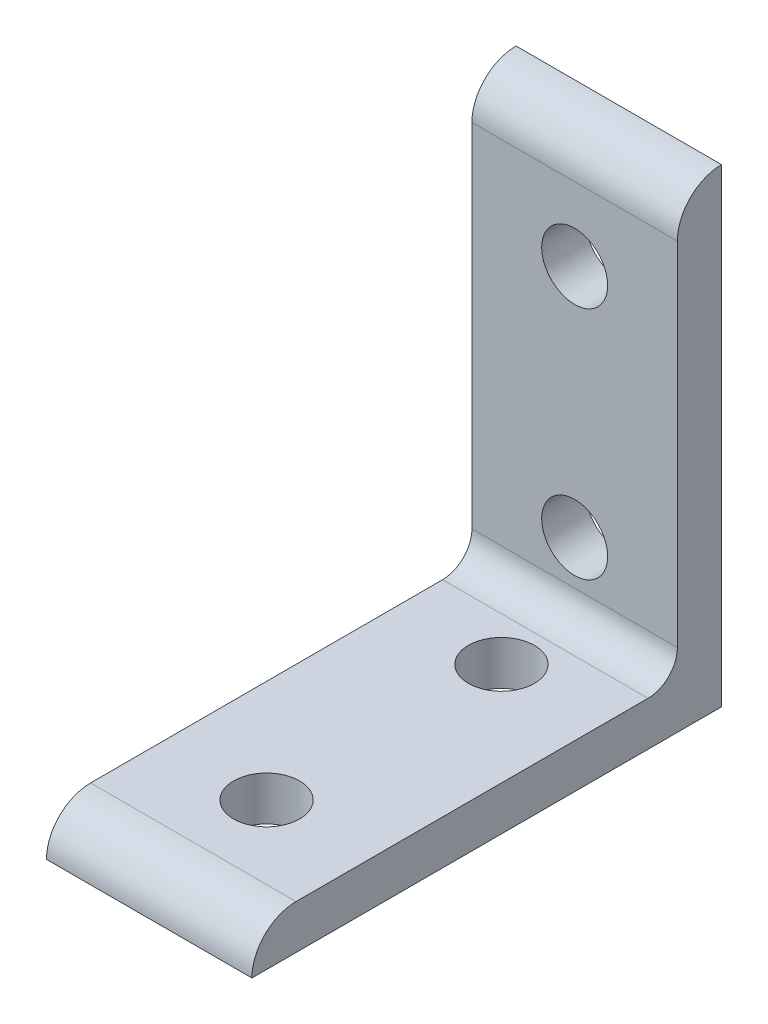
ISO-10303-21;
HEADER;
FILE_DESCRIPTION(('STEP AP214'),'2;1');
FILE_NAME('part.step','',(''),(''),'','','');
FILE_SCHEMA(('AUTOMOTIVE_DESIGN { 1 0 10303 214 1 1 1 1 }'));
ENDSEC;
DATA;
#1=APPLICATION_CONTEXT('core data for automotive mechanical design processes');
#2=APPLICATION_PROTOCOL_DEFINITION('international standard','automotive_design',2000,#1);
#3=PRODUCT_CONTEXT('',#1,'mechanical');
#4=PRODUCT('Part','Part','',(#3));
#5=PRODUCT_RELATED_PRODUCT_CATEGORY('part','',(#4));
#6=PRODUCT_DEFINITION_FORMATION('','',#4);
#7=PRODUCT_DEFINITION_CONTEXT('part definition',#1,'design');
#8=PRODUCT_DEFINITION('design','',#6,#7);
#9=PRODUCT_DEFINITION_SHAPE('','',#8);
#10=(LENGTH_UNIT() NAMED_UNIT(*) SI_UNIT(.MILLI.,.METRE.));
#11=(NAMED_UNIT(*) PLANE_ANGLE_UNIT() SI_UNIT($,.RADIAN.));
#12=(NAMED_UNIT(*) SI_UNIT($,.STERADIAN.) SOLID_ANGLE_UNIT());
#13=UNCERTAINTY_MEASURE_WITH_UNIT(LENGTH_MEASURE(1.E-05),#10,'distance_accuracy_value','');
#14=(GEOMETRIC_REPRESENTATION_CONTEXT(3) GLOBAL_UNCERTAINTY_ASSIGNED_CONTEXT((#13)) GLOBAL_UNIT_ASSIGNED_CONTEXT((#10,
#11,#12)) REPRESENTATION_CONTEXT('',''));
#15=CARTESIAN_POINT('',(0.,0.,0.));
#16=DIRECTION('',(0.,0.,1.));
#17=DIRECTION('',(1.,0.,0.));
#18=AXIS2_PLACEMENT_3D('',#15,#16,#17);
#19=CARTESIAN_POINT('',(0.,67.9224746981368,-22.6008362054));
#20=DIRECTION('',(1.,0.,0.));
#21=DIRECTION('',(0.,0.,-1.));
#22=AXIS2_PLACEMENT_3D('',#19,#20,#21);
#23=CYLINDRICAL_SURFACE('',#22,4.7752);
#24=CARTESIAN_POINT('',(22.225,67.9224746981368,-22.6008362054));
#25=DIRECTION('',(1.,0.,0.));
#26=DIRECTION('',(0.,0.,-1.));
#27=AXIS2_PLACEMENT_3D('',#24,#25,#26);
#28=CIRCLE('',#27,4.7752);
#29=CARTESIAN_POINT('',(22.225,72.6976746981368,-22.6008362054));
#30=VERTEX_POINT('',#29);
#31=CARTESIAN_POINT('',(22.225,67.9224746981368,-17.8256362054));
#32=VERTEX_POINT('',#31);
#33=EDGE_CURVE('E130',#30,#32,#28,.T.);
#34=ORIENTED_EDGE('',*,*,#33,.F.);
#35=DIRECTION('',(1.,0.,0.));
#36=VECTOR('',#35,1.);
#37=CARTESIAN_POINT('',(0.,72.6976746981368,-22.6008362054));
#38=LINE('',#37,#36);
#39=CARTESIAN_POINT('',(0.,72.6976746981368,-22.6008362054));
#40=VERTEX_POINT('',#39);
#41=EDGE_CURVE('E112',#40,#30,#38,.T.);
#42=ORIENTED_EDGE('',*,*,#41,.F.);
#43=CARTESIAN_POINT('',(0.,67.9224746981368,-22.6008362054));
#44=DIRECTION('',(1.,0.,0.));
#45=DIRECTION('',(0.,0.,-1.));
#46=AXIS2_PLACEMENT_3D('',#43,#44,#45);
#47=CIRCLE('',#46,4.7752);
#48=CARTESIAN_POINT('',(0.,67.9224746981368,-17.8256362054));
#49=VERTEX_POINT('',#48);
#50=EDGE_CURVE('E107',#40,#49,#47,.T.);
#51=ORIENTED_EDGE('',*,*,#50,.T.);
#52=DIRECTION('',(1.,0.,0.));
#53=VECTOR('',#52,1.);
#54=CARTESIAN_POINT('',(0.,67.9224746981368,-17.8256362054));
#55=LINE('',#54,#53);
#56=EDGE_CURVE('E89',#49,#32,#55,.T.);
#57=ORIENTED_EDGE('',*,*,#56,.T.);
#58=EDGE_LOOP('',(#34,#42,#51,#57));
#59=FACE_BOUND('',#58,.T.);
#60=ADVANCED_FACE('F32',(#59),#23,.T.);
#61=CARTESIAN_POINT('',(0.,21.8976746958,-22.6008362054));
#62=DIRECTION('',(0.,0.,-1.));
#63=DIRECTION('',(0.,1.,0.));
#64=AXIS2_PLACEMENT_3D('',#61,#62,#63);
#65=PLANE('',#64);
#66=CARTESIAN_POINT('',(11.1125,59.9976746958,-22.6008362054));
#67=DIRECTION('',(0.,0.,-1.));
#68=DIRECTION('',(-1.,0.,0.));
#69=AXIS2_PLACEMENT_3D('',#66,#67,#68);
#70=CIRCLE('',#69,3.56869999999999);
#71=CARTESIAN_POINT('',(7.54380000000001,59.9976746958,-22.6008362054));
#72=VERTEX_POINT('',#71);
#73=EDGE_CURVE('E216',#72,#72,#70,.T.);
#74=ORIENTED_EDGE('',*,*,#73,.F.);
#75=EDGE_LOOP('',(#74));
#76=FACE_BOUND('',#75,.T.);
#77=CARTESIAN_POINT('',(11.1125,34.5976746958,-22.6008362054));
#78=DIRECTION('',(0.,0.,-1.));
#79=DIRECTION('',(-1.,0.,0.));
#80=AXIS2_PLACEMENT_3D('',#77,#78,#79);
#81=CIRCLE('',#80,3.56869999999999);
#82=CARTESIAN_POINT('',(7.54380000000001,34.5976746958,-22.6008362054));
#83=VERTEX_POINT('',#82);
#84=EDGE_CURVE('E227',#83,#83,#81,.T.);
#85=ORIENTED_EDGE('',*,*,#84,.F.);
#86=EDGE_LOOP('',(#85));
#87=FACE_BOUND('',#86,.T.);
#88=DIRECTION('',(0.,1.,0.));
#89=VECTOR('',#88,1.);
#90=CARTESIAN_POINT('',(22.225,21.8976746958,-22.6008362054));
#91=LINE('',#90,#89);
#92=CARTESIAN_POINT('',(22.225,21.8976746958,-22.6008362054));
#93=VERTEX_POINT('',#92);
#94=EDGE_CURVE('E113',#93,#30,#91,.T.);
#95=ORIENTED_EDGE('',*,*,#94,.F.);
#96=DIRECTION('',(1.,0.,0.));
#97=VECTOR('',#96,1.);
#98=CARTESIAN_POINT('',(0.,21.8976746958,-22.6008362054));
#99=LINE('',#98,#97);
#100=CARTESIAN_POINT('',(0.,21.8976746958,-22.6008362054));
#101=VERTEX_POINT('',#100);
#102=EDGE_CURVE('E142',#101,#93,#99,.T.);
#103=ORIENTED_EDGE('',*,*,#102,.F.);
#104=DIRECTION('',(0.,1.,0.));
#105=VECTOR('',#104,1.);
#106=CARTESIAN_POINT('',(0.,21.8976746958,-22.6008362054));
#107=LINE('',#106,#105);
#108=EDGE_CURVE('E101',#101,#40,#107,.T.);
#109=ORIENTED_EDGE('',*,*,#108,.T.);
#110=ORIENTED_EDGE('',*,*,#41,.T.);
#111=EDGE_LOOP('',(#95,#103,#109,#110));
#112=FACE_BOUND('',#111,.T.);
#113=ADVANCED_FACE('F154',(#76,#87,#112),#65,.T.);
#114=CARTESIAN_POINT('',(0.,21.8976746958,28.1991637969368));
#115=DIRECTION('',(0.,-1.,0.));
#116=DIRECTION('',(0.,0.,-1.));
#117=AXIS2_PLACEMENT_3D('',#114,#115,#116);
#118=PLANE('',#117);
#119=CARTESIAN_POINT('',(11.1125,21.8976746958,-9.9008362054));
#120=DIRECTION('',(0.,1.,0.));
#121=DIRECTION('',(0.,0.,1.));
#122=AXIS2_PLACEMENT_3D('',#119,#120,#121);
#123=CIRCLE('',#122,3.5687);
#124=CARTESIAN_POINT('',(11.1125,21.8976746958,-6.3321362054));
#125=VERTEX_POINT('',#124);
#126=EDGE_CURVE('E214',#125,#125,#123,.T.);
#127=ORIENTED_EDGE('',*,*,#126,.T.);
#128=EDGE_LOOP('',(#127));
#129=FACE_BOUND('',#128,.T.);
#130=CARTESIAN_POINT('',(11.1125,21.8976746958,15.4991637946));
#131=DIRECTION('',(0.,1.,0.));
#132=DIRECTION('',(0.,0.,1.));
#133=AXIS2_PLACEMENT_3D('',#130,#131,#132);
#134=CIRCLE('',#133,3.5687);
#135=CARTESIAN_POINT('',(11.1125,21.8976746958,19.0678637946));
#136=VERTEX_POINT('',#135);
#137=EDGE_CURVE('E209',#136,#136,#134,.T.);
#138=ORIENTED_EDGE('',*,*,#137,.T.);
#139=EDGE_LOOP('',(#138));
#140=FACE_BOUND('',#139,.T.);
#141=DIRECTION('',(0.,0.,-1.));
#142=VECTOR('',#141,1.);
#143=CARTESIAN_POINT('',(22.225,21.8976746958,28.1991637969368));
#144=LINE('',#143,#142);
#145=CARTESIAN_POINT('',(22.225,21.8976746958,28.1991637969368));
#146=VERTEX_POINT('',#145);
#147=EDGE_CURVE('E116',#146,#93,#144,.T.);
#148=ORIENTED_EDGE('',*,*,#147,.F.);
#149=DIRECTION('',(1.,0.,0.));
#150=VECTOR('',#149,1.);
#151=CARTESIAN_POINT('',(0.,21.8976746958,28.1991637969368));
#152=LINE('',#151,#150);
#153=CARTESIAN_POINT('',(0.,21.8976746958,28.1991637969368));
#154=VERTEX_POINT('',#153);
#155=EDGE_CURVE('E144',#154,#146,#152,.T.);
#156=ORIENTED_EDGE('',*,*,#155,.F.);
#157=DIRECTION('',(0.,0.,-1.));
#158=VECTOR('',#157,1.);
#159=CARTESIAN_POINT('',(0.,21.8976746958,28.1991637969368));
#160=LINE('',#159,#158);
#161=EDGE_CURVE('E126',#154,#101,#160,.T.);
#162=ORIENTED_EDGE('',*,*,#161,.T.);
#163=ORIENTED_EDGE('',*,*,#102,.T.);
#164=EDGE_LOOP('',(#148,#156,#162,#163));
#165=FACE_BOUND('',#164,.T.);
#166=ADVANCED_FACE('F175',(#129,#140,#165),#118,.T.);
#167=CARTESIAN_POINT('',(0.,21.8976746958,23.4239637946));
#168=DIRECTION('',(1.,0.,0.));
#169=DIRECTION('',(0.,0.,-1.));
#170=AXIS2_PLACEMENT_3D('',#167,#168,#169);
#171=CYLINDRICAL_SURFACE('',#170,4.7752000023368);
#172=CARTESIAN_POINT('',(22.225,21.8976746958,23.4239637946));
#173=DIRECTION('',(1.,0.,0.));
#174=DIRECTION('',(0.,0.,-1.));
#175=AXIS2_PLACEMENT_3D('',#172,#173,#174);
#176=CIRCLE('',#175,4.7752000023368);
#177=CARTESIAN_POINT('',(22.225,26.6728746981368,23.4239637946));
#178=VERTEX_POINT('',#177);
#179=EDGE_CURVE('E135',#178,#146,#176,.T.);
#180=ORIENTED_EDGE('',*,*,#179,.F.);
#181=DIRECTION('',(1.,0.,0.));
#182=VECTOR('',#181,1.);
#183=CARTESIAN_POINT('',(0.,26.6728746981368,23.4239637946));
#184=LINE('',#183,#182);
#185=CARTESIAN_POINT('',(0.,26.6728746981368,23.4239637946));
#186=VERTEX_POINT('',#185);
#187=EDGE_CURVE('E100',#186,#178,#184,.T.);
#188=ORIENTED_EDGE('',*,*,#187,.F.);
#189=CARTESIAN_POINT('',(0.,21.8976746958,23.4239637946));
#190=DIRECTION('',(1.,0.,0.));
#191=DIRECTION('',(0.,0.,-1.));
#192=AXIS2_PLACEMENT_3D('',#189,#190,#191);
#193=CIRCLE('',#192,4.7752000023368);
#194=EDGE_CURVE('E123',#186,#154,#193,.T.);
#195=ORIENTED_EDGE('',*,*,#194,.T.);
#196=ORIENTED_EDGE('',*,*,#155,.T.);
#197=EDGE_LOOP('',(#180,#188,#195,#196));
#198=FACE_BOUND('',#197,.T.);
#199=ADVANCED_FACE('F161',(#198),#171,.T.);
#200=CARTESIAN_POINT('',(0.,26.6728746981368,-17.8256362054));
#201=DIRECTION('',(0.,1.,0.));
#202=DIRECTION('',(0.,0.,1.));
#203=AXIS2_PLACEMENT_3D('',#200,#201,#202);
#204=PLANE('',#203);
#205=CARTESIAN_POINT('',(11.1125,26.6728746981368,-9.9008362054));
#206=DIRECTION('',(0.,1.,0.));
#207=DIRECTION('',(0.,0.,1.));
#208=AXIS2_PLACEMENT_3D('',#205,#206,#207);
#209=CIRCLE('',#208,3.5687);
#210=CARTESIAN_POINT('',(11.1125,26.6728746981368,-6.3321362054));
#211=VERTEX_POINT('',#210);
#212=EDGE_CURVE('E219',#211,#211,#209,.T.);
#213=ORIENTED_EDGE('',*,*,#212,.F.);
#214=EDGE_LOOP('',(#213));
#215=FACE_BOUND('',#214,.T.);
#216=CARTESIAN_POINT('',(11.1125,26.6728746981368,15.4991637946));
#217=DIRECTION('',(0.,1.,0.));
#218=DIRECTION('',(0.,0.,1.));
#219=AXIS2_PLACEMENT_3D('',#216,#217,#218);
#220=CIRCLE('',#219,3.5687);
#221=CARTESIAN_POINT('',(11.1125,26.6728746981368,19.0678637946));
#222=VERTEX_POINT('',#221);
#223=EDGE_CURVE('E212',#222,#222,#220,.T.);
#224=ORIENTED_EDGE('',*,*,#223,.F.);
#225=EDGE_LOOP('',(#224));
#226=FACE_BOUND('',#225,.T.);
#227=DIRECTION('',(0.,0.,1.));
#228=VECTOR('',#227,1.);
#229=CARTESIAN_POINT('',(22.225,26.6728746981368,-17.8256362054));
#230=LINE('',#229,#228);
#231=CARTESIAN_POINT('',(22.225,26.6728746981368,-14.6506362054));
#232=VERTEX_POINT('',#231);
#233=EDGE_CURVE('E133',#232,#178,#230,.T.);
#234=ORIENTED_EDGE('',*,*,#233,.F.);
#235=DIRECTION('',(1.,0.,0.));
#236=VECTOR('',#235,1.);
#237=CARTESIAN_POINT('',(0.,26.6728746981368,-14.6506362054));
#238=LINE('',#237,#236);
#239=CARTESIAN_POINT('',(0.,26.6728746981368,-14.6506362054));
#240=VERTEX_POINT('',#239);
#241=EDGE_CURVE('E47',#232,#240,#238,.F.);
#242=ORIENTED_EDGE('',*,*,#241,.T.);
#243=DIRECTION('',(0.,0.,1.));
#244=VECTOR('',#243,1.);
#245=CARTESIAN_POINT('',(0.,26.6728746981368,-17.8256362054));
#246=LINE('',#245,#244);
#247=EDGE_CURVE('E110',#240,#186,#246,.T.);
#248=ORIENTED_EDGE('',*,*,#247,.T.);
#249=ORIENTED_EDGE('',*,*,#187,.T.);
#250=EDGE_LOOP('',(#234,#242,#248,#249));
#251=FACE_BOUND('',#250,.T.);
#252=ADVANCED_FACE('F162',(#215,#226,#251),#204,.T.);
#253=CARTESIAN_POINT('',(0.,67.9224746981368,-17.8256362054));
#254=DIRECTION('',(0.,0.,1.));
#255=DIRECTION('',(0.,-1.,0.));
#256=AXIS2_PLACEMENT_3D('',#253,#254,#255);
#257=PLANE('',#256);
#258=CARTESIAN_POINT('',(11.1125,59.9976746958,-17.8256362054));
#259=DIRECTION('',(0.,0.,1.));
#260=DIRECTION('',(0.,-1.,0.));
#261=AXIS2_PLACEMENT_3D('',#258,#259,#260);
#262=CIRCLE('',#261,3.56869999999999);
#263=CARTESIAN_POINT('',(11.1125,56.4289746958,-17.8256362054));
#264=VERTEX_POINT('',#263);
#265=EDGE_CURVE('E225',#264,#264,#262,.T.);
#266=ORIENTED_EDGE('',*,*,#265,.F.);
#267=EDGE_LOOP('',(#266));
#268=FACE_BOUND('',#267,.T.);
#269=CARTESIAN_POINT('',(11.1125,34.5976746958,-17.8256362054));
#270=DIRECTION('',(0.,0.,1.));
#271=DIRECTION('',(0.,-1.,0.));
#272=AXIS2_PLACEMENT_3D('',#269,#270,#271);
#273=CIRCLE('',#272,3.56869999999999);
#274=CARTESIAN_POINT('',(11.1125,31.0289746958,-17.8256362054));
#275=VERTEX_POINT('',#274);
#276=EDGE_CURVE('E119',#275,#275,#273,.T.);
#277=ORIENTED_EDGE('',*,*,#276,.F.);
#278=EDGE_LOOP('',(#277));
#279=FACE_BOUND('',#278,.T.);
#280=DIRECTION('',(0.,-1.,0.));
#281=VECTOR('',#280,1.);
#282=CARTESIAN_POINT('',(0.,67.9224746981368,-17.8256362054));
#283=LINE('',#282,#281);
#284=CARTESIAN_POINT('',(0.,29.8478746981368,-17.8256362054));
#285=VERTEX_POINT('',#284);
#286=EDGE_CURVE('E93',#49,#285,#283,.T.);
#287=ORIENTED_EDGE('',*,*,#286,.T.);
#288=DIRECTION('',(1.,0.,0.));
#289=VECTOR('',#288,1.);
#290=CARTESIAN_POINT('',(22.225,29.8478746981368,-17.8256362054));
#291=LINE('',#290,#289);
#292=CARTESIAN_POINT('',(22.225,29.8478746981368,-17.8256362054));
#293=VERTEX_POINT('',#292);
#294=EDGE_CURVE('E141',#285,#293,#291,.T.);
#295=ORIENTED_EDGE('',*,*,#294,.T.);
#296=DIRECTION('',(0.,-1.,0.));
#297=VECTOR('',#296,1.);
#298=CARTESIAN_POINT('',(22.225,67.9224746981368,-17.8256362054));
#299=LINE('',#298,#297);
#300=EDGE_CURVE('E95',#32,#293,#299,.T.);
#301=ORIENTED_EDGE('',*,*,#300,.F.);
#302=ORIENTED_EDGE('',*,*,#56,.F.);
#303=EDGE_LOOP('',(#287,#295,#301,#302));
#304=FACE_BOUND('',#303,.T.);
#305=ADVANCED_FACE('F91',(#268,#279,#304),#257,.T.);
#306=CARTESIAN_POINT('',(0.,67.9224746981368,-22.6008362054));
#307=DIRECTION('',(1.,0.,0.));
#308=DIRECTION('',(0.,0.,-1.));
#309=AXIS2_PLACEMENT_3D('',#306,#307,#308);
#310=PLANE('',#309);
#311=ORIENTED_EDGE('',*,*,#50,.F.);
#312=ORIENTED_EDGE('',*,*,#108,.F.);
#313=ORIENTED_EDGE('',*,*,#161,.F.);
#314=ORIENTED_EDGE('',*,*,#194,.F.);
#315=ORIENTED_EDGE('',*,*,#247,.F.);
#316=CARTESIAN_POINT('',(0.,29.8478746981368,-14.6506362054));
#317=DIRECTION('',(1.,0.,0.));
#318=DIRECTION('',(0.,0.,-1.));
#319=AXIS2_PLACEMENT_3D('',#316,#317,#318);
#320=CIRCLE('',#319,3.175);
#321=EDGE_CURVE('E11',#240,#285,#320,.T.);
#322=ORIENTED_EDGE('',*,*,#321,.T.);
#323=ORIENTED_EDGE('',*,*,#286,.F.);
#324=EDGE_LOOP('',(#311,#312,#313,#314,#315,#322,#323));
#325=FACE_BOUND('',#324,.T.);
#326=ADVANCED_FACE('F105',(#325),#310,.F.);
#327=CARTESIAN_POINT('',(22.225,67.9224746981368,-22.6008362054));
#328=DIRECTION('',(1.,0.,0.));
#329=DIRECTION('',(0.,0.,-1.));
#330=AXIS2_PLACEMENT_3D('',#327,#328,#329);
#331=PLANE('',#330);
#332=ORIENTED_EDGE('',*,*,#33,.T.);
#333=ORIENTED_EDGE('',*,*,#300,.T.);
#334=CARTESIAN_POINT('',(22.225,29.8478746981368,-14.6506362054));
#335=DIRECTION('',(1.,0.,0.));
#336=DIRECTION('',(0.,0.,-1.));
#337=AXIS2_PLACEMENT_3D('',#334,#335,#336);
#338=CIRCLE('',#337,3.175);
#339=EDGE_CURVE('E40',#293,#232,#338,.F.);
#340=ORIENTED_EDGE('',*,*,#339,.T.);
#341=ORIENTED_EDGE('',*,*,#233,.T.);
#342=ORIENTED_EDGE('',*,*,#179,.T.);
#343=ORIENTED_EDGE('',*,*,#147,.T.);
#344=ORIENTED_EDGE('',*,*,#94,.T.);
#345=EDGE_LOOP('',(#332,#333,#340,#341,#342,#343,#344));
#346=FACE_BOUND('',#345,.T.);
#347=ADVANCED_FACE('F150',(#346),#331,.T.);
#348=CARTESIAN_POINT('',(11.1125,34.5976746958,-22.6008362054));
#349=DIRECTION('',(0.,0.,-1.));
#350=DIRECTION('',(-1.,0.,0.));
#351=AXIS2_PLACEMENT_3D('',#348,#349,#350);
#352=CYLINDRICAL_SURFACE('',#351,3.56869999999999);
#353=ORIENTED_EDGE('',*,*,#276,.T.);
#354=EDGE_LOOP('',(#353));
#355=FACE_BOUND('',#354,.T.);
#356=ORIENTED_EDGE('',*,*,#84,.T.);
#357=EDGE_LOOP('',(#356));
#358=FACE_BOUND('',#357,.T.);
#359=ADVANCED_FACE('F192',(#355,#358),#352,.F.);
#360=CARTESIAN_POINT('',(11.1125,59.9976746958,-22.6008362054));
#361=DIRECTION('',(0.,0.,-1.));
#362=DIRECTION('',(-1.,0.,0.));
#363=AXIS2_PLACEMENT_3D('',#360,#361,#362);
#364=CYLINDRICAL_SURFACE('',#363,3.56869999999999);
#365=ORIENTED_EDGE('',*,*,#265,.T.);
#366=EDGE_LOOP('',(#365));
#367=FACE_BOUND('',#366,.T.);
#368=ORIENTED_EDGE('',*,*,#73,.T.);
#369=EDGE_LOOP('',(#368));
#370=FACE_BOUND('',#369,.T.);
#371=ADVANCED_FACE('F197',(#367,#370),#364,.F.);
#372=CARTESIAN_POINT('',(11.1125,26.6728746981368,15.4991637946));
#373=DIRECTION('',(0.,1.,0.));
#374=DIRECTION('',(0.,0.,1.));
#375=AXIS2_PLACEMENT_3D('',#372,#373,#374);
#376=CYLINDRICAL_SURFACE('',#375,3.5687);
#377=ORIENTED_EDGE('',*,*,#137,.F.);
#378=EDGE_LOOP('',(#377));
#379=FACE_BOUND('',#378,.T.);
#380=ORIENTED_EDGE('',*,*,#223,.T.);
#381=EDGE_LOOP('',(#380));
#382=FACE_BOUND('',#381,.T.);
#383=ADVANCED_FACE('F168',(#379,#382),#376,.F.);
#384=CARTESIAN_POINT('',(11.1125,26.6728746981368,-9.9008362054));
#385=DIRECTION('',(0.,1.,0.));
#386=DIRECTION('',(0.,0.,1.));
#387=AXIS2_PLACEMENT_3D('',#384,#385,#386);
#388=CYLINDRICAL_SURFACE('',#387,3.5687);
#389=ORIENTED_EDGE('',*,*,#126,.F.);
#390=EDGE_LOOP('',(#389));
#391=FACE_BOUND('',#390,.T.);
#392=ORIENTED_EDGE('',*,*,#212,.T.);
#393=EDGE_LOOP('',(#392));
#394=FACE_BOUND('',#393,.T.);
#395=ADVANCED_FACE('F164',(#391,#394),#388,.F.);
#396=CARTESIAN_POINT('',(0.,29.8478746981368,-14.6506362054));
#397=DIRECTION('',(-1.,0.,0.));
#398=DIRECTION('',(0.,0.,1.));
#399=AXIS2_PLACEMENT_3D('',#396,#397,#398);
#400=CYLINDRICAL_SURFACE('',#399,3.175);
#401=ORIENTED_EDGE('',*,*,#321,.F.);
#402=ORIENTED_EDGE('',*,*,#241,.F.);
#403=ORIENTED_EDGE('',*,*,#339,.F.);
#404=ORIENTED_EDGE('',*,*,#294,.F.);
#405=EDGE_LOOP('',(#401,#402,#403,#404));
#406=FACE_BOUND('',#405,.T.);
#407=ADVANCED_FACE('F34',(#406),#400,.F.);
#408=CLOSED_SHELL('',(#60,#113,#166,#199,#252,#305,#326,#347,#359,#371,#383,#395,#407));
#409=MANIFOLD_SOLID_BREP('B2',#408);
#410=ADVANCED_BREP_SHAPE_REPRESENTATION('',(#18,#409),#14);
#411=SHAPE_DEFINITION_REPRESENTATION(#9,#410);
ENDSEC;
END-ISO-10303-21;
